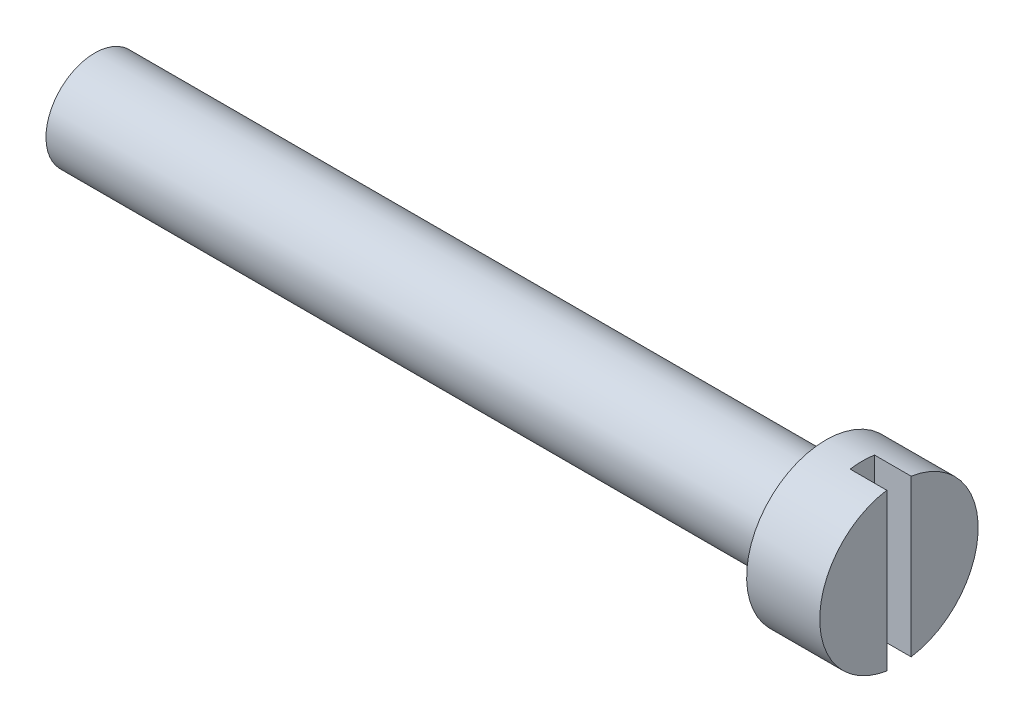
ISO-10303-21;
HEADER;
FILE_DESCRIPTION(('STEP AP214'),'2;1');
FILE_NAME('part.step','',(''),(''),'','','');
FILE_SCHEMA(('AUTOMOTIVE_DESIGN { 1 0 10303 214 1 1 1 1 }'));
ENDSEC;
DATA;
#1=APPLICATION_CONTEXT('core data for automotive mechanical design processes');
#2=APPLICATION_PROTOCOL_DEFINITION('international standard','automotive_design',2000,#1);
#3=PRODUCT_CONTEXT('',#1,'mechanical');
#4=PRODUCT('Part','Part','',(#3));
#5=PRODUCT_RELATED_PRODUCT_CATEGORY('part','',(#4));
#6=PRODUCT_DEFINITION_FORMATION('','',#4);
#7=PRODUCT_DEFINITION_CONTEXT('part definition',#1,'design');
#8=PRODUCT_DEFINITION('design','',#6,#7);
#9=PRODUCT_DEFINITION_SHAPE('','',#8);
#10=(LENGTH_UNIT() NAMED_UNIT(*) SI_UNIT(.MILLI.,.METRE.));
#11=(NAMED_UNIT(*) PLANE_ANGLE_UNIT() SI_UNIT($,.RADIAN.));
#12=(NAMED_UNIT(*) SI_UNIT($,.STERADIAN.) SOLID_ANGLE_UNIT());
#13=UNCERTAINTY_MEASURE_WITH_UNIT(LENGTH_MEASURE(1.E-05),#10,'distance_accuracy_value','');
#14=(GEOMETRIC_REPRESENTATION_CONTEXT(3) GLOBAL_UNCERTAINTY_ASSIGNED_CONTEXT((#13)) GLOBAL_UNIT_ASSIGNED_CONTEXT((#10,
#11,#12)) REPRESENTATION_CONTEXT('',''));
#15=CARTESIAN_POINT('',(0.,0.,0.));
#16=DIRECTION('',(0.,0.,1.));
#17=DIRECTION('',(1.,0.,0.));
#18=AXIS2_PLACEMENT_3D('',#15,#16,#17);
#19=CARTESIAN_POINT('',(0.,3.25,0.));
#20=DIRECTION('',(1.,0.,0.));
#21=DIRECTION('',(0.,1.,0.));
#22=AXIS2_PLACEMENT_3D('',#19,#20,#21);
#23=PLANE('',#22);
#24=DIRECTION('',(0.,1.,0.));
#25=VECTOR('',#24,1.);
#26=CARTESIAN_POINT('',(0.,-3.25,-0.5));
#27=LINE('',#26,#25);
#28=CARTESIAN_POINT('',(0.,-3.21130814466628,-0.5));
#29=VERTEX_POINT('',#28);
#30=CARTESIAN_POINT('',(0.,3.21130814466628,-0.5));
#31=VERTEX_POINT('',#30);
#32=EDGE_CURVE('E88',#29,#31,#27,.T.);
#33=ORIENTED_EDGE('',*,*,#32,.F.);
#34=CARTESIAN_POINT('',(0.,0.,0.));
#35=DIRECTION('',(1.,0.,0.));
#36=DIRECTION('',(0.,1.,0.));
#37=AXIS2_PLACEMENT_3D('',#34,#35,#36);
#38=CIRCLE('',#37,3.25);
#39=EDGE_CURVE('E99',#29,#31,#38,.T.);
#40=ORIENTED_EDGE('',*,*,#39,.T.);
#41=EDGE_LOOP('',(#33,#40));
#42=FACE_BOUND('',#41,.T.);
#43=ADVANCED_FACE('F45',(#42),#23,.T.);
#44=DIRECTION('',(0.,-1.,0.));
#45=VECTOR('',#44,1.);
#46=CARTESIAN_POINT('',(0.,-3.25,0.5));
#47=LINE('',#46,#45);
#48=CARTESIAN_POINT('',(0.,3.21130814466628,0.5));
#49=VERTEX_POINT('',#48);
#50=CARTESIAN_POINT('',(0.,-3.21130814466628,0.5));
#51=VERTEX_POINT('',#50);
#52=EDGE_CURVE('E101',#49,#51,#47,.T.);
#53=ORIENTED_EDGE('',*,*,#52,.F.);
#54=EDGE_CURVE('E106',#49,#51,#38,.T.);
#55=ORIENTED_EDGE('',*,*,#54,.T.);
#56=EDGE_LOOP('',(#53,#55));
#57=FACE_BOUND('',#56,.T.);
#58=ADVANCED_FACE('F47',(#57),#23,.T.);
#59=CARTESIAN_POINT('',(-33.,0.,0.));
#60=DIRECTION('',(-1.,0.,0.));
#61=DIRECTION('',(0.,-1.,0.));
#62=AXIS2_PLACEMENT_3D('',#59,#60,#61);
#63=PLANE('',#62);
#64=CARTESIAN_POINT('',(-33.,0.,0.));
#65=DIRECTION('',(1.,0.,0.));
#66=DIRECTION('',(0.,1.,0.));
#67=AXIS2_PLACEMENT_3D('',#64,#65,#66);
#68=CIRCLE('',#67,2.);
#69=CARTESIAN_POINT('',(-33.,2.,0.));
#70=VERTEX_POINT('',#69);
#71=EDGE_CURVE('E122',#70,#70,#68,.T.);
#72=ORIENTED_EDGE('',*,*,#71,.F.);
#73=EDGE_LOOP('',(#72));
#74=FACE_BOUND('',#73,.T.);
#75=ADVANCED_FACE('F154',(#74),#63,.T.);
#76=CARTESIAN_POINT('',(0.,0.,0.));
#77=DIRECTION('',(1.,0.,0.));
#78=DIRECTION('',(0.,1.,0.));
#79=AXIS2_PLACEMENT_3D('',#76,#77,#78);
#80=CYLINDRICAL_SURFACE('',#79,2.);
#81=ORIENTED_EDGE('',*,*,#71,.T.);
#82=EDGE_LOOP('',(#81));
#83=FACE_BOUND('',#82,.T.);
#84=CARTESIAN_POINT('',(-3.,0.,0.));
#85=DIRECTION('',(1.,0.,0.));
#86=DIRECTION('',(0.,1.,0.));
#87=AXIS2_PLACEMENT_3D('',#84,#85,#86);
#88=CIRCLE('',#87,2.);
#89=CARTESIAN_POINT('',(-3.,2.,0.));
#90=VERTEX_POINT('',#89);
#91=EDGE_CURVE('E118',#90,#90,#88,.T.);
#92=ORIENTED_EDGE('',*,*,#91,.F.);
#93=EDGE_LOOP('',(#92));
#94=FACE_BOUND('',#93,.T.);
#95=ADVANCED_FACE('F159',(#83,#94),#80,.T.);
#96=CARTESIAN_POINT('',(-3.,2.,0.));
#97=DIRECTION('',(-1.,0.,0.));
#98=DIRECTION('',(0.,-1.,0.));
#99=AXIS2_PLACEMENT_3D('',#96,#97,#98);
#100=PLANE('',#99);
#101=ORIENTED_EDGE('',*,*,#91,.T.);
#102=EDGE_LOOP('',(#101));
#103=FACE_BOUND('',#102,.T.);
#104=CARTESIAN_POINT('',(-3.,0.,0.));
#105=DIRECTION('',(1.,0.,0.));
#106=DIRECTION('',(0.,1.,0.));
#107=AXIS2_PLACEMENT_3D('',#104,#105,#106);
#108=CIRCLE('',#107,3.25);
#109=CARTESIAN_POINT('',(-3.,3.25,0.));
#110=VERTEX_POINT('',#109);
#111=EDGE_CURVE('E111',#110,#110,#108,.T.);
#112=ORIENTED_EDGE('',*,*,#111,.F.);
#113=EDGE_LOOP('',(#112));
#114=FACE_BOUND('',#113,.T.);
#115=ADVANCED_FACE('F164',(#103,#114),#100,.T.);
#116=CARTESIAN_POINT('',(0.,0.,0.));
#117=DIRECTION('',(1.,0.,0.));
#118=DIRECTION('',(0.,1.,0.));
#119=AXIS2_PLACEMENT_3D('',#116,#117,#118);
#120=CYLINDRICAL_SURFACE('',#119,3.25);
#121=DIRECTION('',(1.,0.,0.));
#122=VECTOR('',#121,1.);
#123=CARTESIAN_POINT('',(0.,3.21130814466628,-0.5));
#124=LINE('',#123,#122);
#125=CARTESIAN_POINT('',(-1.5,3.21130814466628,-0.5));
#126=VERTEX_POINT('',#125);
#127=EDGE_CURVE('E11',#31,#126,#124,.F.);
#128=ORIENTED_EDGE('',*,*,#127,.F.);
#129=ORIENTED_EDGE('',*,*,#39,.F.);
#130=DIRECTION('',(1.,0.,0.));
#131=VECTOR('',#130,1.);
#132=CARTESIAN_POINT('',(0.,-3.21130814466628,-0.5));
#133=LINE('',#132,#131);
#134=CARTESIAN_POINT('',(-1.5,-3.21130814466628,-0.5));
#135=VERTEX_POINT('',#134);
#136=EDGE_CURVE('E85',#135,#29,#133,.T.);
#137=ORIENTED_EDGE('',*,*,#136,.F.);
#138=CARTESIAN_POINT('',(-1.5,0.,0.));
#139=DIRECTION('',(-1.,0.,0.));
#140=DIRECTION('',(0.,-1.,0.));
#141=AXIS2_PLACEMENT_3D('',#138,#139,#140);
#142=CIRCLE('',#141,3.25);
#143=CARTESIAN_POINT('',(-1.5,-3.21130814466628,0.5));
#144=VERTEX_POINT('',#143);
#145=EDGE_CURVE('E126',#144,#135,#142,.F.);
#146=ORIENTED_EDGE('',*,*,#145,.F.);
#147=DIRECTION('',(1.,0.,0.));
#148=VECTOR('',#147,1.);
#149=CARTESIAN_POINT('',(0.,-3.21130814466628,0.5));
#150=LINE('',#149,#148);
#151=EDGE_CURVE('E95',#51,#144,#150,.F.);
#152=ORIENTED_EDGE('',*,*,#151,.F.);
#153=ORIENTED_EDGE('',*,*,#54,.F.);
#154=DIRECTION('',(1.,0.,0.));
#155=VECTOR('',#154,1.);
#156=CARTESIAN_POINT('',(0.,3.21130814466628,0.5));
#157=LINE('',#156,#155);
#158=CARTESIAN_POINT('',(-1.5,3.21130814466628,0.5));
#159=VERTEX_POINT('',#158);
#160=EDGE_CURVE('E54',#159,#49,#157,.T.);
#161=ORIENTED_EDGE('',*,*,#160,.F.);
#162=EDGE_CURVE('E66',#126,#159,#142,.F.);
#163=ORIENTED_EDGE('',*,*,#162,.F.);
#164=EDGE_LOOP('',(#128,#129,#137,#146,#152,#153,#161,#163));
#165=FACE_BOUND('',#164,.T.);
#166=ORIENTED_EDGE('',*,*,#111,.T.);
#167=EDGE_LOOP('',(#166));
#168=FACE_BOUND('',#167,.T.);
#169=ADVANCED_FACE('F103',(#165,#168),#120,.T.);
#170=CARTESIAN_POINT('',(-1.5,-3.25,-0.5));
#171=DIRECTION('',(0.,0.,-1.));
#172=DIRECTION('',(-1.,0.,0.));
#173=AXIS2_PLACEMENT_3D('',#170,#171,#172);
#174=PLANE('',#173);
#175=ORIENTED_EDGE('',*,*,#127,.T.);
#176=DIRECTION('',(0.,1.,0.));
#177=VECTOR('',#176,1.);
#178=CARTESIAN_POINT('',(-1.5,-3.25,-0.5));
#179=LINE('',#178,#177);
#180=EDGE_CURVE('E90',#135,#126,#179,.T.);
#181=ORIENTED_EDGE('',*,*,#180,.F.);
#182=ORIENTED_EDGE('',*,*,#136,.T.);
#183=ORIENTED_EDGE('',*,*,#32,.T.);
#184=EDGE_LOOP('',(#175,#181,#182,#183));
#185=FACE_BOUND('',#184,.T.);
#186=ADVANCED_FACE('F87',(#185),#174,.F.);
#187=CARTESIAN_POINT('',(-1.5,-3.25,0.5));
#188=DIRECTION('',(0.,0.,1.));
#189=DIRECTION('',(1.,0.,0.));
#190=AXIS2_PLACEMENT_3D('',#187,#188,#189);
#191=PLANE('',#190);
#192=ORIENTED_EDGE('',*,*,#151,.T.);
#193=DIRECTION('',(0.,-1.,0.));
#194=VECTOR('',#193,1.);
#195=CARTESIAN_POINT('',(-1.5,-3.25,0.5));
#196=LINE('',#195,#194);
#197=EDGE_CURVE('E61',#159,#144,#196,.T.);
#198=ORIENTED_EDGE('',*,*,#197,.F.);
#199=ORIENTED_EDGE('',*,*,#160,.T.);
#200=ORIENTED_EDGE('',*,*,#52,.T.);
#201=EDGE_LOOP('',(#192,#198,#199,#200));
#202=FACE_BOUND('',#201,.T.);
#203=ADVANCED_FACE('F135',(#202),#191,.F.);
#204=CARTESIAN_POINT('',(-1.5,0.,0.));
#205=DIRECTION('',(-1.,0.,0.));
#206=DIRECTION('',(0.,-1.,0.));
#207=AXIS2_PLACEMENT_3D('',#204,#205,#206);
#208=PLANE('',#207);
#209=ORIENTED_EDGE('',*,*,#180,.T.);
#210=ORIENTED_EDGE('',*,*,#162,.T.);
#211=ORIENTED_EDGE('',*,*,#197,.T.);
#212=ORIENTED_EDGE('',*,*,#145,.T.);
#213=EDGE_LOOP('',(#209,#210,#211,#212));
#214=FACE_BOUND('',#213,.T.);
#215=ADVANCED_FACE('F140',(#214),#208,.F.);
#216=CLOSED_SHELL('',(#43,#58,#75,#95,#115,#169,#186,#203,#215));
#217=MANIFOLD_SOLID_BREP('B2',#216);
#218=ADVANCED_BREP_SHAPE_REPRESENTATION('',(#18,#217),#14);
#219=SHAPE_DEFINITION_REPRESENTATION(#9,#218);
ENDSEC;
END-ISO-10303-21;
